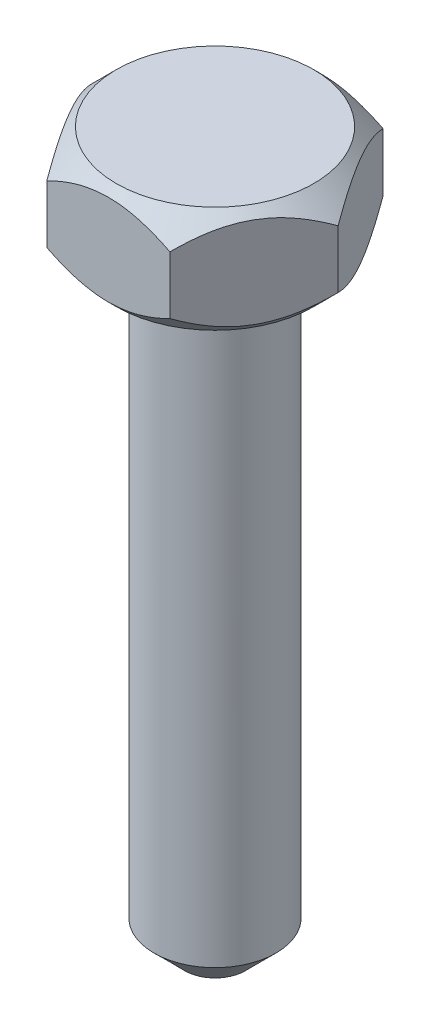
ISO-10303-21;
HEADER;
FILE_DESCRIPTION(('STEP AP214'),'2;1');
FILE_NAME('part.step','',(''),(''),'','','');
FILE_SCHEMA(('AUTOMOTIVE_DESIGN { 1 0 10303 214 1 1 1 1 }'));
ENDSEC;
DATA;
#1=APPLICATION_CONTEXT('core data for automotive mechanical design processes');
#2=APPLICATION_PROTOCOL_DEFINITION('international standard','automotive_design',2000,#1);
#3=PRODUCT_CONTEXT('',#1,'mechanical');
#4=PRODUCT('Part','Part','',(#3));
#5=PRODUCT_RELATED_PRODUCT_CATEGORY('part','',(#4));
#6=PRODUCT_DEFINITION_FORMATION('','',#4);
#7=PRODUCT_DEFINITION_CONTEXT('part definition',#1,'design');
#8=PRODUCT_DEFINITION('design','',#6,#7);
#9=PRODUCT_DEFINITION_SHAPE('','',#8);
#10=(LENGTH_UNIT() NAMED_UNIT(*) SI_UNIT(.MILLI.,.METRE.));
#11=(NAMED_UNIT(*) PLANE_ANGLE_UNIT() SI_UNIT($,.RADIAN.));
#12=(NAMED_UNIT(*) SI_UNIT($,.STERADIAN.) SOLID_ANGLE_UNIT());
#13=UNCERTAINTY_MEASURE_WITH_UNIT(LENGTH_MEASURE(1.E-05),#10,'distance_accuracy_value','');
#14=(GEOMETRIC_REPRESENTATION_CONTEXT(3) GLOBAL_UNCERTAINTY_ASSIGNED_CONTEXT((#13)) GLOBAL_UNIT_ASSIGNED_CONTEXT((#10,
#11,#12)) REPRESENTATION_CONTEXT('',''));
#15=CARTESIAN_POINT('',(0.,0.,0.));
#16=DIRECTION('',(0.,0.,1.));
#17=DIRECTION('',(1.,0.,0.));
#18=AXIS2_PLACEMENT_3D('',#15,#16,#17);
#19=CARTESIAN_POINT('',(-4.04145188432739,-3.5,0.));
#20=DIRECTION('',(0.,1.,0.));
#21=DIRECTION('',(0.,0.,1.));
#22=AXIS2_PLACEMENT_3D('',#19,#20,#21);
#23=PLANE('',#22);
#24=CARTESIAN_POINT('',(0.,-3.5,0.));
#25=DIRECTION('',(0.,1.,0.));
#26=DIRECTION('',(0.,0.,1.));
#27=AXIS2_PLACEMENT_3D('',#24,#25,#26);
#28=CIRCLE('',#27,3.24145188432739);
#29=CARTESIAN_POINT('',(0.,-3.5,3.24145188432739));
#30=VERTEX_POINT('',#29);
#31=EDGE_CURVE('E102',#30,#30,#28,.T.);
#32=ORIENTED_EDGE('',*,*,#31,.F.);
#33=EDGE_LOOP('',(#32));
#34=FACE_BOUND('',#33,.T.);
#35=CARTESIAN_POINT('',(0.,-3.5,0.));
#36=DIRECTION('',(0.,1.,0.));
#37=DIRECTION('',(0.,0.,1.));
#38=AXIS2_PLACEMENT_3D('',#35,#36,#37);
#39=CIRCLE('',#38,2.);
#40=CARTESIAN_POINT('',(0.,-3.5,2.));
#41=VERTEX_POINT('',#40);
#42=EDGE_CURVE('E117',#41,#41,#39,.F.);
#43=ORIENTED_EDGE('',*,*,#42,.F.);
#44=EDGE_LOOP('',(#43));
#45=FACE_BOUND('',#44,.T.);
#46=ADVANCED_FACE('F29',(#34,#45),#23,.F.);
#47=CARTESIAN_POINT('',(0.,-23.5,0.));
#48=DIRECTION('',(0.,1.,0.));
#49=DIRECTION('',(0.,0.,1.));
#50=AXIS2_PLACEMENT_3D('',#47,#48,#49);
#51=CYLINDRICAL_SURFACE('',#50,2.);
#52=CARTESIAN_POINT('',(0.,-22.5,0.));
#53=DIRECTION('',(0.,-1.,0.));
#54=DIRECTION('',(0.,0.,-1.));
#55=AXIS2_PLACEMENT_3D('',#52,#53,#54);
#56=CIRCLE('',#55,2.);
#57=CARTESIAN_POINT('',(0.,-22.5,-2.));
#58=VERTEX_POINT('',#57);
#59=EDGE_CURVE('E42',#58,#58,#56,.F.);
#60=ORIENTED_EDGE('',*,*,#59,.T.);
#61=EDGE_LOOP('',(#60));
#62=FACE_BOUND('',#61,.T.);
#63=ORIENTED_EDGE('',*,*,#42,.T.);
#64=EDGE_LOOP('',(#63));
#65=FACE_BOUND('',#64,.T.);
#66=ADVANCED_FACE('F126',(#62,#65),#51,.T.);
#67=CARTESIAN_POINT('',(0.,-23.5,0.));
#68=DIRECTION('',(0.,-1.,0.));
#69=DIRECTION('',(0.,0.,-1.));
#70=AXIS2_PLACEMENT_3D('',#67,#68,#69);
#71=PLANE('',#70);
#72=CARTESIAN_POINT('',(0.,-23.5,0.));
#73=DIRECTION('',(0.,-1.,0.));
#74=DIRECTION('',(0.,0.,-1.));
#75=AXIS2_PLACEMENT_3D('',#72,#73,#74);
#76=CIRCLE('',#75,0.999999999999997);
#77=CARTESIAN_POINT('',(0.,-23.5,-0.999999999999997));
#78=VERTEX_POINT('',#77);
#79=EDGE_CURVE('E120',#78,#78,#76,.T.);
#80=ORIENTED_EDGE('',*,*,#79,.T.);
#81=EDGE_LOOP('',(#80));
#82=FACE_BOUND('',#81,.T.);
#83=ADVANCED_FACE('F132',(#82),#71,.T.);
#84=CARTESIAN_POINT('',(0.,-23.5,0.));
#85=DIRECTION('',(0.,1.,0.));
#86=DIRECTION('',(0.,0.,1.));
#87=AXIS2_PLACEMENT_3D('',#84,#85,#86);
#88=CONICAL_SURFACE('',#87,0.999999999999997,0.785398163397447);
#89=ORIENTED_EDGE('',*,*,#59,.F.);
#90=EDGE_LOOP('',(#89));
#91=FACE_BOUND('',#90,.T.);
#92=ORIENTED_EDGE('',*,*,#79,.F.);
#93=EDGE_LOOP('',(#92));
#94=FACE_BOUND('',#93,.T.);
#95=ADVANCED_FACE('F129',(#91,#94),#88,.T.);
#96=CARTESIAN_POINT('',(0.,-3.5,0.));
#97=DIRECTION('',(0.,1.,0.));
#98=DIRECTION('',(0.,0.,1.));
#99=AXIS2_PLACEMENT_3D('',#96,#97,#98);
#100=CONICAL_SURFACE('',#99,3.24145188432739,0.785398163397448);
#101=CARTESIAN_POINT('',(-4.04156735438123,-2.69988452499759,0.000200000000024374));
#102=CARTESIAN_POINT('',(-3.97210706066971,-2.76928406626867,-0.120108757816985));
#103=CARTESIAN_POINT('',(-3.90148531215406,-2.83460752114448,-0.242429214365436));
#104=CARTESIAN_POINT('',(-3.75747991147154,-2.95421294831347,-0.491853884911885));
#105=CARTESIAN_POINT('',(-3.68408256574986,-3.00842837712061,-0.618981816842531));
#106=CARTESIAN_POINT('',(-3.53608035685404,-3.10130032476617,-0.875329162282505));
#107=CARTESIAN_POINT('',(-3.4615131811703,-3.14019025979249,-1.00448329914366));
#108=CARTESIAN_POINT('',(-3.310737295381,-3.20010809560693,-1.26563479388693));
#109=CARTESIAN_POINT('',(-3.2345331906662,-3.22118071965238,-1.39762417499826));
#110=CARTESIAN_POINT('',(-3.10319782183118,-3.24019388535166,-1.62510370665133));
#111=CARTESIAN_POINT('',(-3.04823615399914,-3.24300830014006,-1.72030010780514));
#112=CARTESIAN_POINT('',(-2.93840222621348,-3.23826531256006,-1.91053805112477));
#113=CARTESIAN_POINT('',(-2.88353000435282,-3.23070427424299,-2.00557952731161));
#114=CARTESIAN_POINT('',(-2.77430542200353,-3.20564210374561,-2.19476205337608));
#115=CARTESIAN_POINT('',(-2.71995371223669,-3.1881298536199,-2.28890197617048));
#116=CARTESIAN_POINT('',(-2.61218376551828,-3.14412110260569,-2.47556499941575));
#117=CARTESIAN_POINT('',(-2.55876545732786,-3.11762529053566,-2.56808822325595));
#118=CARTESIAN_POINT('',(-2.46393368006796,-3.06311203056568,-2.73234167964214));
#119=CARTESIAN_POINT('',(-2.42231028209656,-3.03652769615024,-2.80443551971227));
#120=CARTESIAN_POINT('',(-2.33981072759412,-2.97907462503668,-2.94732893971228));
#121=CARTESIAN_POINT('',(-2.29893459386685,-2.94820575783654,-3.01812848014491));
#122=CARTESIAN_POINT('',(-2.21805834837752,-2.88287565935588,-3.15821024645784));
#123=CARTESIAN_POINT('',(-2.17805593632086,-2.84842572434904,-3.22749645656527));
#124=CARTESIAN_POINT('',(-2.09879193666162,-2.77638590028467,-3.36478573118621));
#125=CARTESIAN_POINT('',(-2.05952991236256,-2.73879793793946,-3.43278955208019));
#126=CARTESIAN_POINT('',(-2.02061047210986,-2.69988452499759,-3.5002));
#127=B_SPLINE_CURVE_WITH_KNOTS('',3,(#101,#102,#103,#104,#105,#106,#107,#108,#109,#110,#111,
#112,#113,#114,#115,#116,#117,#118,#119,#120,#121,#122,#123,#124,#125,#126),.UNSPECIFIED.,.F.,
.F.,(4,2,2,2,2,2,2,2,2,2,2,2,4),(0.,0.466195029511836,0.93510605524767,1.39657035229711,
1.85687285909026,2.18628459516077,2.51581179896772,2.845707891424,3.17557869467338,
3.4376213889119,3.69967206642682,3.96091985737579,4.22200840855898),.UNSPECIFIED.);
#128=CARTESIAN_POINT('',(-4.04145188432739,-2.7,0.));
#129=VERTEX_POINT('',#128);
#130=CARTESIAN_POINT('',(-2.02072594216371,-2.7,-3.5));
#131=VERTEX_POINT('',#130);
#132=EDGE_CURVE('E177',#129,#131,#127,.T.);
#133=ORIENTED_EDGE('',*,*,#132,.T.);
#134=CARTESIAN_POINT('',(-4.11343909523356,-1.34049074854832,-3.5));
#135=CARTESIAN_POINT('',(-4.01364790461446,-1.41647576800568,-3.5));
#136=CARTESIAN_POINT('',(-3.91330741187747,-1.4917509457735,-3.5));
#137=CARTESIAN_POINT('',(-3.71130759190236,-1.64056086288985,-3.5));
#138=CARTESIAN_POINT('',(-3.60964794828074,-1.71409517230361,-3.5));
#139=CARTESIAN_POINT('',(-3.40404593483019,-1.85962589901091,-3.5));
#140=CARTESIAN_POINT('',(-3.30009198936034,-1.93160601709034,-3.5));
#141=CARTESIAN_POINT('',(-3.09043455319368,-2.07296300910746,-3.5));
#142=CARTESIAN_POINT('',(-2.98473118535169,-2.14234006473914,-3.5));
#143=CARTESIAN_POINT('',(-2.76489352426084,-2.28196781927053,-3.5));
#144=CARTESIAN_POINT('',(-2.65063360057755,-2.35202171786016,-3.5));
#145=CARTESIAN_POINT('',(-2.41943843809483,-2.48764015461377,-3.5));
#146=CARTESIAN_POINT('',(-2.30250276768208,-2.55320396159193,-3.5));
#147=CARTESIAN_POINT('',(-2.06594770908092,-2.6784356928961,-3.5));
#148=CARTESIAN_POINT('',(-1.94633756764447,-2.73812094705998,-3.5));
#149=CARTESIAN_POINT('',(-1.70380065325271,-2.85025883184051,-3.5));
#150=CARTESIAN_POINT('',(-1.58087544221088,-2.90271479977525,-3.5));
#151=CARTESIAN_POINT('',(-1.34256664054354,-2.99425414604565,-3.5));
#152=CARTESIAN_POINT('',(-1.22748347184254,-3.03411159832747,-3.5));
#153=CARTESIAN_POINT('',(-0.994473602956439,-3.10460445258339,-3.5));
#154=CARTESIAN_POINT('',(-0.876546714407832,-3.13523924184055,-3.5));
#155=CARTESIAN_POINT('',(-0.640555797612561,-3.18515136149643,-3.5));
#156=CARTESIAN_POINT('',(-0.522534731770002,-3.20462846737207,-3.5));
#157=CARTESIAN_POINT('',(-0.285138833258746,-3.23183388871137,-3.5));
#158=CARTESIAN_POINT('',(-0.165764258218942,-3.23956440343576,-3.5));
#159=CARTESIAN_POINT('',(0.0684345425591306,-3.24266430583436,-3.5));
#160=CARTESIAN_POINT('',(0.183252604656246,-3.23850904804464,-3.5));
#161=CARTESIAN_POINT('',(0.41194538139855,-3.21913596089254,-3.5));
#162=CARTESIAN_POINT('',(0.525820005903612,-3.20391708651605,-3.5));
#163=CARTESIAN_POINT('',(0.753728692005361,-3.16300182207144,-3.5));
#164=CARTESIAN_POINT('',(0.867729673651151,-3.13712416826838,-3.5));
#165=CARTESIAN_POINT('',(1.09323660944141,-3.07629621041035,-3.5));
#166=CARTESIAN_POINT('',(1.20474274230377,-3.04134655850057,-3.5));
#167=CARTESIAN_POINT('',(1.43351745819777,-2.96089193875029,-3.5));
#168=CARTESIAN_POINT('',(1.55057121674902,-2.91478260530312,-3.5));
#169=CARTESIAN_POINT('',(1.78163768388521,-2.81546896217881,-3.5));
#170=CARTESIAN_POINT('',(1.8956493792125,-2.76226232305919,-3.5));
#171=CARTESIAN_POINT('',(2.12120309504484,-2.65000927106598,-3.5));
#172=CARTESIAN_POINT('',(2.23273581617762,-2.59094432351664,-3.5));
#173=CARTESIAN_POINT('',(2.45323999840432,-2.46828035973536,-3.5));
#174=CARTESIAN_POINT('',(2.56221185705048,-2.40468205353482,-3.5));
#175=CARTESIAN_POINT('',(2.77258648527557,-2.27708230144591,-3.5));
#176=CARTESIAN_POINT('',(2.87409670716152,-2.21325707762329,-3.5));
#177=CARTESIAN_POINT('',(3.07537374659972,-2.08290631812229,-3.5));
#178=CARTESIAN_POINT('',(3.17514043189724,-2.01638057885912,-3.5));
#179=CARTESIAN_POINT('',(3.37235277259435,-1.88165662424084,-3.5));
#180=CARTESIAN_POINT('',(3.46981066719971,-1.81347626064957,-3.5));
#181=CARTESIAN_POINT('',(3.66339199507936,-1.67530022312019,-3.5));
#182=CARTESIAN_POINT('',(3.75951578844138,-1.60530505424452,-3.5));
#183=CARTESIAN_POINT('',(3.85508044256854,-1.53456747820942,-3.5));
#184=B_SPLINE_CURVE_WITH_KNOTS('',3,(#134,#135,#136,#137,#138,#139,#140,#141,#142,#143,#144,
#145,#146,#147,#148,#149,#150,#151,#152,#153,#154,#155,#156,#157,#158,#159,#160,#161,#162,#163,
#164,#165,#166,#167,#168,#169,#170,#171,#172,#173,#174,#175,#176,#177,#178,#179,#180,#181,#182,
#183),.UNSPECIFIED.,.F.,.F.,(4,2,2,2,2,2,2,2,2,2,2,2,2,2,2,2,2,2,2,2,2,2,2,2,4),(0.,
0.376289066832934,0.752670114666427,1.13196303882771,1.51122943887124,1.91322439656266,
2.31528466194431,2.71612176675466,3.11677320534959,3.48182442073459,3.84689988331699,
4.20521619183289,4.56346540614943,4.90758964289977,5.25174638813573,5.60201478075691,
5.95225800112648,6.32939036689254,6.70664681914763,7.08513741857289,7.46356886710629,
7.82324340751906,8.18294511339456,8.53974109313966,8.89643881996947),.UNSPECIFIED.);
#185=CARTESIAN_POINT('',(2.02072594216368,-2.7,-3.50000000000001));
#186=VERTEX_POINT('',#185);
#187=EDGE_CURVE('E171',#131,#186,#184,.T.);
#188=ORIENTED_EDGE('',*,*,#187,.T.);
#189=CARTESIAN_POINT('',(2.02061047210985,-2.69988452499759,-3.5002));
#190=CARTESIAN_POINT('',(2.09007076582137,-2.76928406626868,-3.37989124218299));
#191=CARTESIAN_POINT('',(2.16069251433702,-2.83460752114448,-3.25757078563454));
#192=CARTESIAN_POINT('',(2.30469791501954,-2.95421294831348,-3.00814611508809));
#193=CARTESIAN_POINT('',(2.37809526074122,-3.00842837712062,-2.88101818315745));
#194=CARTESIAN_POINT('',(2.52609746963704,-3.10130032476618,-2.62467083771748));
#195=CARTESIAN_POINT('',(2.60066464532078,-3.14019025979249,-2.49551670085632));
#196=CARTESIAN_POINT('',(2.75144053111008,-3.20010809560693,-2.23436520611305));
#197=CARTESIAN_POINT('',(2.82764463582487,-3.22118071965239,-2.10237582500172));
#198=CARTESIAN_POINT('',(2.9589800046599,-3.24019388535166,-1.87489629334866));
#199=CARTESIAN_POINT('',(3.01394167249194,-3.24300830014006,-1.77969989219485));
#200=CARTESIAN_POINT('',(3.1237756002776,-3.23826531256006,-1.58946194887522));
#201=CARTESIAN_POINT('',(3.17864782213825,-3.230704274243,-1.49442047268838));
#202=CARTESIAN_POINT('',(3.28787240448755,-3.20564210374561,-1.30523794662391));
#203=CARTESIAN_POINT('',(3.34222411425439,-3.1881298536199,-1.21109802382951));
#204=CARTESIAN_POINT('',(3.4499940609728,-3.14412110260569,-1.02443500058424));
#205=CARTESIAN_POINT('',(3.50341236916322,-3.11762529053566,-0.931911776744044));
#206=CARTESIAN_POINT('',(3.59824414642312,-3.06311203056568,-0.767658320357851));
#207=CARTESIAN_POINT('',(3.63986754439452,-3.03652769615024,-0.695564480287724));
#208=CARTESIAN_POINT('',(3.72236709889696,-2.97907462503668,-0.552671060287705));
#209=CARTESIAN_POINT('',(3.76324323262423,-2.94820575783654,-0.48187151985508));
#210=CARTESIAN_POINT('',(3.84411947811356,-2.88287565935588,-0.34178975354215));
#211=CARTESIAN_POINT('',(3.88412189017022,-2.84842572434904,-0.272503543434717));
#212=CARTESIAN_POINT('',(3.96338588982947,-2.77638590028467,-0.135214268813778));
#213=CARTESIAN_POINT('',(4.00264791412853,-2.73879793793945,-0.0672104479197994));
#214=CARTESIAN_POINT('',(4.04156735438122,-2.69988452499759,0.000200000000013168));
#215=B_SPLINE_CURVE_WITH_KNOTS('',3,(#189,#190,#191,#192,#193,#194,#195,#196,#197,#198,#199,
#200,#201,#202,#203,#204,#205,#206,#207,#208,#209,#210,#211,#212,#213,#214),.UNSPECIFIED.,.F.,
.F.,(4,2,2,2,2,2,2,2,2,2,2,2,4),(0.,0.466195029511833,0.935106055247664,1.3965703522971,
1.85687285909024,2.18628459516076,2.51581179896771,2.84570789142399,3.17557869467336,
3.43762138891188,3.69967206642681,3.96091985737578,4.22200840855897),.UNSPECIFIED.);
#216=CARTESIAN_POINT('',(4.04145188432739,-2.7,0.));
#217=VERTEX_POINT('',#216);
#218=EDGE_CURVE('E90',#186,#217,#215,.T.);
#219=ORIENTED_EDGE('',*,*,#218,.T.);
#220=CARTESIAN_POINT('',(4.04156735438122,-2.69988452499759,-0.000199999999987047));
#221=CARTESIAN_POINT('',(3.9721070606697,-2.76928406626868,0.120108757817022));
#222=CARTESIAN_POINT('',(3.90148531215406,-2.83460752114448,0.242429214365472));
#223=CARTESIAN_POINT('',(3.75747991147153,-2.95421294831348,0.491853884911919));
#224=CARTESIAN_POINT('',(3.68408256574985,-3.00842837712061,0.618981816842565));
#225=CARTESIAN_POINT('',(3.53608035685403,-3.10130032476617,0.875329162282538));
#226=CARTESIAN_POINT('',(3.46151318117029,-3.14019025979249,1.00448329914369));
#227=CARTESIAN_POINT('',(3.31073729538099,-3.20010809560693,1.26563479388696));
#228=CARTESIAN_POINT('',(3.23453319066619,-3.22118071965239,1.39762417499829));
#229=CARTESIAN_POINT('',(3.10319782183116,-3.24019388535166,1.62510370665136));
#230=CARTESIAN_POINT('',(3.04823615399913,-3.24300830014006,1.72030010780516));
#231=CARTESIAN_POINT('',(2.93840222621346,-3.23826531256006,1.91053805112479));
#232=CARTESIAN_POINT('',(2.88353000435281,-3.230704274243,2.00557952731163));
#233=CARTESIAN_POINT('',(2.77430542200351,-3.20564210374561,2.19476205337611));
#234=CARTESIAN_POINT('',(2.71995371223667,-3.1881298536199,2.2889019761705));
#235=CARTESIAN_POINT('',(2.61218376551826,-3.14412110260569,2.47556499941577));
#236=CARTESIAN_POINT('',(2.55876545732783,-3.11762529053566,2.56808822325597));
#237=CARTESIAN_POINT('',(2.46393368006794,-3.06311203056568,2.73234167964216));
#238=CARTESIAN_POINT('',(2.42231028209654,-3.03652769615024,2.80443551971228));
#239=CARTESIAN_POINT('',(2.3398107275941,-2.97907462503668,2.9473289397123));
#240=CARTESIAN_POINT('',(2.29893459386683,-2.94820575783654,3.01812848014492));
#241=CARTESIAN_POINT('',(2.2180583483775,-2.88287565935588,3.15821024645785));
#242=CARTESIAN_POINT('',(2.17805593632084,-2.84842572434904,3.22749645656528));
#243=CARTESIAN_POINT('',(2.0987919366616,-2.77638590028468,3.36478573118621));
#244=CARTESIAN_POINT('',(2.05952991236254,-2.73879793793947,3.43278955208019));
#245=CARTESIAN_POINT('',(2.02061047210984,-2.6998845249976,3.5002));
#246=B_SPLINE_CURVE_WITH_KNOTS('',3,(#220,#221,#222,#223,#224,#225,#226,#227,#228,#229,#230,
#231,#232,#233,#234,#235,#236,#237,#238,#239,#240,#241,#242,#243,#244,#245),.UNSPECIFIED.,.F.,
.F.,(4,2,2,2,2,2,2,2,2,2,2,2,4),(0.,0.466195029511836,0.93510605524767,1.39657035229711,
1.85687285909025,2.18628459516077,2.51581179896772,2.845707891424,3.17557869467337,
3.43762138891189,3.69967206642681,3.96091985737577,4.22200840855895),.UNSPECIFIED.);
#247=CARTESIAN_POINT('',(2.02072594216371,-2.7,3.5));
#248=VERTEX_POINT('',#247);
#249=EDGE_CURVE('E86',#217,#248,#246,.T.);
#250=ORIENTED_EDGE('',*,*,#249,.T.);
#251=CARTESIAN_POINT('',(-4.11343909532792,-1.34049074847645,3.5));
#252=CARTESIAN_POINT('',(-4.01364790470614,-1.41647576793658,3.5));
#253=CARTESIAN_POINT('',(-3.91330741196645,-1.49175094570717,3.5));
#254=CARTESIAN_POINT('',(-3.71130759198594,-1.64056086282906,3.5));
#255=CARTESIAN_POINT('',(-3.6096479483616,-1.71409517224557,3.5));
#256=CARTESIAN_POINT('',(-3.40404593490552,-1.8596258989584,3.5));
#257=CARTESIAN_POINT('',(-3.30009198943286,-1.9316060170406,3.5));
#258=CARTESIAN_POINT('',(-3.09043455326054,-2.07296300906322,3.5));
#259=CARTESIAN_POINT('',(-2.98473118541569,-2.14234006469764,3.5));
#260=CARTESIAN_POINT('',(-2.76489352431867,-2.28196781923471,3.5));
#261=CARTESIAN_POINT('',(-2.65063360063206,-2.35202171782728,3.5));
#262=CARTESIAN_POINT('',(-2.41943843814258,-2.48764015458666,3.5));
#263=CARTESIAN_POINT('',(-2.3025027677264,-2.55320396156762,3.5));
#264=CARTESIAN_POINT('',(-2.06594770911824,-2.67843569287718,3.5));
#265=CARTESIAN_POINT('',(-1.94633756767823,-2.73812094704364,3.5));
#266=CARTESIAN_POINT('',(-1.70380065327916,-2.85025883182901,3.5));
#267=CARTESIAN_POINT('',(-1.58087544223358,-2.902714799766,3.5));
#268=CARTESIAN_POINT('',(-1.34256664056464,-2.99425414603802,3.5));
#269=CARTESIAN_POINT('',(-1.22748347186597,-3.03411159831963,3.5));
#270=CARTESIAN_POINT('',(-0.994473602984598,-3.10460445257561,3.5));
#271=CARTESIAN_POINT('',(-0.876546714438396,-3.13523924183304,3.5));
#272=CARTESIAN_POINT('',(-0.640555797647857,-3.18515136148999,3.5));
#273=CARTESIAN_POINT('',(-0.522534731807625,-3.20462846736643,3.5));
#274=CARTESIAN_POINT('',(-0.285138833300951,-3.23183388870786,3.5));
#275=CARTESIAN_POINT('',(-0.165764258263403,-3.23956440343358,3.5));
#276=CARTESIAN_POINT('',(0.0684345425106541,-3.24266430583524,3.5));
#277=CARTESIAN_POINT('',(0.183252604606004,-3.23850904804722,3.5));
#278=CARTESIAN_POINT('',(0.411945381344963,-3.21913596089876,3.5));
#279=CARTESIAN_POINT('',(0.525820005848445,-3.20391708652421,3.5));
#280=CARTESIAN_POINT('',(0.753728691947076,-3.16300182208367,3.5));
#281=CARTESIAN_POINT('',(0.867729673591332,-3.13712416828275,3.5));
#282=CARTESIAN_POINT('',(1.09323660937868,-3.07629621042903,3.5));
#283=CARTESIAN_POINT('',(1.20474274223966,-3.04134655852143,3.5));
#284=CARTESIAN_POINT('',(1.4335174581261,-2.96089193877731,3.5));
#285=CARTESIAN_POINT('',(1.5505712166713,-2.9147826053345,3.5));
#286=CARTESIAN_POINT('',(1.78163768379569,-2.81546896221932,3.5));
#287=CARTESIAN_POINT('',(1.89564937911723,-2.76226232310448,3.5));
#288=CARTESIAN_POINT('',(2.12120309493829,-2.65000927112113,3.5));
#289=CARTESIAN_POINT('',(2.23273581606554,-2.59094432357686,3.5));
#290=CARTESIAN_POINT('',(2.45323999828135,-2.46828035980589,3.5));
#291=CARTESIAN_POINT('',(2.56221185692215,-2.40468205361059,3.5));
#292=CARTESIAN_POINT('',(2.77258648513752,-2.27708230153161,3.5));
#293=CARTESIAN_POINT('',(2.87409670701908,-2.21325707771367,3.5));
#294=CARTESIAN_POINT('',(3.07537374644856,-2.08290631822205,3.5));
#295=CARTESIAN_POINT('',(3.17514043174175,-2.01638057896358,3.5));
#296=CARTESIAN_POINT('',(3.37235277243031,-1.88165662435465,3.5));
#297=CARTESIAN_POINT('',(3.46981066703145,-1.81347626076803,3.5));
#298=CARTESIAN_POINT('',(3.66339199490269,-1.67530022324793,3.5));
#299=CARTESIAN_POINT('',(3.75951578826051,-1.60530505437691,3.5));
#300=CARTESIAN_POINT('',(3.85508044238348,-1.53456747834644,3.5));
#301=B_SPLINE_CURVE_WITH_KNOTS('',3,(#251,#252,#253,#254,#255,#256,#257,#258,#259,#260,#261,
#262,#263,#264,#265,#266,#267,#268,#269,#270,#271,#272,#273,#274,#275,#276,#277,#278,#279,#280,
#281,#282,#283,#284,#285,#286,#287,#288,#289,#290,#291,#292,#293,#294,#295,#296,#297,#298,#299,
#300),.UNSPECIFIED.,.F.,.F.,(4,2,2,2,2,2,2,2,2,2,2,2,2,2,2,2,2,2,2,2,2,2,2,2,4),(0.,
0.376289066844382,0.752670114689327,1.13196303886228,1.51122943891747,1.91322439662199,
2.31528466201676,2.7161217668401,3.11677320544801,3.48182442082625,3.84689988340191,
4.20521619191135,4.56346540622143,4.90758964296631,5.25174638819682,5.60201478081209,
5.95225800117576,6.32939036692017,6.70664681915359,7.08513741855706,7.46356886706867,
7.82324340746283,8.1829451133197,8.53974109304643,8.89643881985787),.UNSPECIFIED.);
#302=CARTESIAN_POINT('',(-2.02072594216367,-2.70000000000002,3.5));
#303=VERTEX_POINT('',#302);
#304=EDGE_CURVE('E48',#248,#303,#301,.F.);
#305=ORIENTED_EDGE('',*,*,#304,.T.);
#306=CARTESIAN_POINT('',(-2.02061047210983,-2.69988452499761,3.5002));
#307=CARTESIAN_POINT('',(-2.09007076582135,-2.76928406626869,3.37989124218299));
#308=CARTESIAN_POINT('',(-2.160692514337,-2.83460752114449,3.25757078563455));
#309=CARTESIAN_POINT('',(-2.30469791501952,-2.95421294831349,3.0081461150881));
#310=CARTESIAN_POINT('',(-2.3780952607412,-3.00842837712062,2.88101818315746));
#311=CARTESIAN_POINT('',(-2.52609746963702,-3.10130032476618,2.62467083771749));
#312=CARTESIAN_POINT('',(-2.60066464532076,-3.14019025979249,2.49551670085634));
#313=CARTESIAN_POINT('',(-2.75144053111006,-3.20010809560693,2.23436520611307));
#314=CARTESIAN_POINT('',(-2.82764463582486,-3.22118071965239,2.10237582500175));
#315=CARTESIAN_POINT('',(-2.95898000465988,-3.24019388535166,1.87489629334868));
#316=CARTESIAN_POINT('',(-3.01394167249192,-3.24300830014006,1.77969989219488));
#317=CARTESIAN_POINT('',(-3.12377560027759,-3.23826531256006,1.58946194887525));
#318=CARTESIAN_POINT('',(-3.17864782213824,-3.23070427424299,1.49442047268841));
#319=CARTESIAN_POINT('',(-3.28787240448754,-3.20564210374561,1.30523794662394));
#320=CARTESIAN_POINT('',(-3.34222411425438,-3.1881298536199,1.21109802382954));
#321=CARTESIAN_POINT('',(-3.44999406097279,-3.14412110260569,1.02443500058427));
#322=CARTESIAN_POINT('',(-3.50341236916322,-3.11762529053566,0.931911776744076));
#323=CARTESIAN_POINT('',(-3.59824414642311,-3.06311203056568,0.767658320357883));
#324=CARTESIAN_POINT('',(-3.63986754439451,-3.03652769615024,0.695564480287757));
#325=CARTESIAN_POINT('',(-3.72236709889695,-2.97907462503668,0.552671060287739));
#326=CARTESIAN_POINT('',(-3.76324323262423,-2.94820575783654,0.481871519855115));
#327=CARTESIAN_POINT('',(-3.84411947811356,-2.88287565935587,0.341789753542185));
#328=CARTESIAN_POINT('',(-3.88412189017022,-2.84842572434903,0.272503543434753));
#329=CARTESIAN_POINT('',(-3.96338588982947,-2.77638590028466,0.135214268813814));
#330=CARTESIAN_POINT('',(-4.00264791412853,-2.73879793793945,0.0672104479198363));
#331=CARTESIAN_POINT('',(-4.04156735438123,-2.69988452499759,-0.000199999999975872));
#332=B_SPLINE_CURVE_WITH_KNOTS('',3,(#306,#307,#308,#309,#310,#311,#312,#313,#314,#315,#316,
#317,#318,#319,#320,#321,#322,#323,#324,#325,#326,#327,#328,#329,#330,#331),.UNSPECIFIED.,.F.,
.F.,(4,2,2,2,2,2,2,2,2,2,2,2,4),(0.,0.466195029511828,0.935106055247654,1.39657035229708,
1.85687285909022,2.18628459516074,2.51581179896768,2.84570789142397,3.17557869467334,
3.43762138891186,3.69967206642679,3.96091985737576,4.22200840855895),.UNSPECIFIED.);
#333=EDGE_CURVE('E11',#303,#129,#332,.T.);
#334=ORIENTED_EDGE('',*,*,#333,.T.);
#335=EDGE_LOOP('',(#133,#188,#219,#250,#305,#334));
#336=FACE_BOUND('',#335,.T.);
#337=ORIENTED_EDGE('',*,*,#31,.T.);
#338=EDGE_LOOP('',(#337));
#339=FACE_BOUND('',#338,.T.);
#340=ADVANCED_FACE('F87',(#336,#339),#100,.T.);
#341=CARTESIAN_POINT('',(-4.04145188432739,0.,0.));
#342=DIRECTION('',(0.,1.,0.));
#343=DIRECTION('',(0.,0.,1.));
#344=AXIS2_PLACEMENT_3D('',#341,#342,#343);
#345=PLANE('',#344);
#346=CARTESIAN_POINT('',(0.,0.,0.));
#347=DIRECTION('',(0.,1.,0.));
#348=DIRECTION('',(0.,0.,1.));
#349=AXIS2_PLACEMENT_3D('',#346,#347,#348);
#350=CIRCLE('',#349,3.24145188432739);
#351=CARTESIAN_POINT('',(0.,0.,3.24145188432739));
#352=VERTEX_POINT('',#351);
#353=EDGE_CURVE('E234',#352,#352,#350,.T.);
#354=ORIENTED_EDGE('',*,*,#353,.T.);
#355=EDGE_LOOP('',(#354));
#356=FACE_BOUND('',#355,.T.);
#357=ADVANCED_FACE('F152',(#356),#345,.T.);
#358=CARTESIAN_POINT('',(0.,-0.8,0.));
#359=DIRECTION('',(0.,-1.,0.));
#360=DIRECTION('',(0.,0.,-1.));
#361=AXIS2_PLACEMENT_3D('',#358,#359,#360);
#362=CONICAL_SURFACE('',#361,4.04145188432739,0.785398163397448);
#363=CARTESIAN_POINT('',(-2.02061047210986,-0.800115475002408,-3.5002));
#364=CARTESIAN_POINT('',(-2.09007076582138,-0.730715933731321,-3.37989124218299));
#365=CARTESIAN_POINT('',(-2.16069251433702,-0.665392478855521,-3.25757078563454));
#366=CARTESIAN_POINT('',(-2.30469791501955,-0.545787051686524,-3.00814611508809));
#367=CARTESIAN_POINT('',(-2.37809526074123,-0.491571622879386,-2.88101818315745));
#368=CARTESIAN_POINT('',(-2.52609746963704,-0.398699675233827,-2.62467083771747));
#369=CARTESIAN_POINT('',(-2.60066464532078,-0.359809740207512,-2.49551670085632));
#370=CARTESIAN_POINT('',(-2.75144053111008,-0.299891904393072,-2.23436520611305));
#371=CARTESIAN_POINT('',(-2.82764463582488,-0.278819280347616,-2.10237582500172));
#372=CARTESIAN_POINT('',(-2.95898000465991,-0.259806114648342,-1.87489629334865));
#373=CARTESIAN_POINT('',(-3.01394167249194,-0.256991699859938,-1.77969989219485));
#374=CARTESIAN_POINT('',(-3.12377560027761,-0.261734687439937,-1.58946194887522));
#375=CARTESIAN_POINT('',(-3.17864782213826,-0.269295725757006,-1.49442047268838));
#376=CARTESIAN_POINT('',(-3.28787240448756,-0.294357896254393,-1.3052379466239));
#377=CARTESIAN_POINT('',(-3.34222411425439,-0.311870146380099,-1.2110980238295));
#378=CARTESIAN_POINT('',(-3.4499940609728,-0.355878897394313,-1.02443500058423));
#379=CARTESIAN_POINT('',(-3.50341236916323,-0.382374709464336,-0.931911776744037));
#380=CARTESIAN_POINT('',(-3.59824414642312,-0.436887969434318,-0.767658320357844));
#381=CARTESIAN_POINT('',(-3.63986754439452,-0.463472303849764,-0.695564480287717));
#382=CARTESIAN_POINT('',(-3.72236709889696,-0.520925374963324,-0.552671060287697));
#383=CARTESIAN_POINT('',(-3.76324323262424,-0.551794242163462,-0.481871519855072));
#384=CARTESIAN_POINT('',(-3.84411947811357,-0.617124340644127,-0.34178975354214));
#385=CARTESIAN_POINT('',(-3.88412189017022,-0.651574275650966,-0.272503543434707));
#386=CARTESIAN_POINT('',(-3.96338588982947,-0.723614099715335,-0.135214268813767));
#387=CARTESIAN_POINT('',(-4.00264791412853,-0.761202062060548,-0.0672104479197882));
#388=CARTESIAN_POINT('',(-4.04156735438123,-0.800115475002413,0.000200000000024814));
#389=B_SPLINE_CURVE_WITH_KNOTS('',3,(#363,#364,#365,#366,#367,#368,#369,#370,#371,#372,#373,
#374,#375,#376,#377,#378,#379,#380,#381,#382,#383,#384,#385,#386,#387,#388),.UNSPECIFIED.,.F.,
.F.,(4,2,2,2,2,2,2,2,2,2,2,2,4),(0.,0.466195029511835,0.935106055247666,1.3965703522971,
1.85687285909025,2.18628459516076,2.51581179896771,2.84570789142399,3.17557869467337,
3.43762138891189,3.69967206642682,3.96091985737579,4.22200840855898),.UNSPECIFIED.);
#390=CARTESIAN_POINT('',(-2.02072594216371,-0.8,-3.5));
#391=VERTEX_POINT('',#390);
#392=CARTESIAN_POINT('',(-4.04145188432739,-0.8,0.));
#393=VERTEX_POINT('',#392);
#394=EDGE_CURVE('E116',#391,#393,#389,.T.);
#395=ORIENTED_EDGE('',*,*,#394,.T.);
#396=CARTESIAN_POINT('',(-4.04156735438123,-0.800115475002413,-0.000199999999975714));
#397=CARTESIAN_POINT('',(-3.97210706066971,-0.730715933731325,0.120108757817033));
#398=CARTESIAN_POINT('',(-3.90148531215406,-0.665392478855525,0.242429214365483));
#399=CARTESIAN_POINT('',(-3.75747991147153,-0.545787051686527,0.491853884911931));
#400=CARTESIAN_POINT('',(-3.68408256574985,-0.491571622879388,0.618981816842576));
#401=CARTESIAN_POINT('',(-3.53608035685403,-0.398699675233828,0.875329162282549));
#402=CARTESIAN_POINT('',(-3.46151318117029,-0.359809740207512,1.00448329914371));
#403=CARTESIAN_POINT('',(-3.31073729538099,-0.299891904393072,1.26563479388697));
#404=CARTESIAN_POINT('',(-3.23453319066619,-0.278819280347615,1.3976241749983));
#405=CARTESIAN_POINT('',(-3.10319782183116,-0.259806114648341,1.62510370665137));
#406=CARTESIAN_POINT('',(-3.04823615399912,-0.256991699859937,1.72030010780518));
#407=CARTESIAN_POINT('',(-2.93840222621345,-0.261734687439936,1.9105380511248));
#408=CARTESIAN_POINT('',(-2.8835300043528,-0.269295725757005,2.00557952731164));
#409=CARTESIAN_POINT('',(-2.7743054220035,-0.294357896254393,2.19476205337612));
#410=CARTESIAN_POINT('',(-2.71995371223666,-0.311870146380099,2.28890197617051));
#411=CARTESIAN_POINT('',(-2.61218376551825,-0.355878897394312,2.47556499941578));
#412=CARTESIAN_POINT('',(-2.55876545732782,-0.382374709464335,2.56808822325598));
#413=CARTESIAN_POINT('',(-2.46393368006793,-0.436887969434316,2.73234167964217));
#414=CARTESIAN_POINT('',(-2.42231028209653,-0.463472303849761,2.80443551971229));
#415=CARTESIAN_POINT('',(-2.33981072759409,-0.520925374963318,2.9473289397123));
#416=CARTESIAN_POINT('',(-2.29893459386682,-0.551794242163455,3.01812848014493));
#417=CARTESIAN_POINT('',(-2.21805834837749,-0.617124340644116,3.15821024645785));
#418=CARTESIAN_POINT('',(-2.17805593632083,-0.651574275650953,3.22749645656528));
#419=CARTESIAN_POINT('',(-2.09879193666159,-0.723614099715318,3.36478573118622));
#420=CARTESIAN_POINT('',(-2.05952991236253,-0.76120206206053,3.43278955208019));
#421=CARTESIAN_POINT('',(-2.02061047210983,-0.800115475002393,3.5002));
#422=B_SPLINE_CURVE_WITH_KNOTS('',3,(#396,#397,#398,#399,#400,#401,#402,#403,#404,#405,#406,
#407,#408,#409,#410,#411,#412,#413,#414,#415,#416,#417,#418,#419,#420,#421),.UNSPECIFIED.,.F.,
.F.,(4,2,2,2,2,2,2,2,2,2,2,2,4),(0.,0.466195029511837,0.935106055247671,1.39657035229711,
1.85687285909026,2.18628459516077,2.51581179896772,2.84570789142401,3.17557869467338,
3.43762138891189,3.69967206642681,3.96091985737576,4.22200840855895),.UNSPECIFIED.);
#423=CARTESIAN_POINT('',(-2.02072594216365,-0.8,3.50000000000003));
#424=VERTEX_POINT('',#423);
#425=EDGE_CURVE('E237',#393,#424,#422,.T.);
#426=ORIENTED_EDGE('',*,*,#425,.T.);
#427=CARTESIAN_POINT('',(-4.11343909532793,-2.15950925152355,3.5));
#428=CARTESIAN_POINT('',(-4.01364790470614,-2.08352423206342,3.5));
#429=CARTESIAN_POINT('',(-3.91330741196646,-2.00824905429283,3.5));
#430=CARTESIAN_POINT('',(-3.71130759198594,-1.85943913717094,3.5));
#431=CARTESIAN_POINT('',(-3.60964794836161,-1.78590482775443,3.5));
#432=CARTESIAN_POINT('',(-3.40404593490553,-1.6403741010416,3.5));
#433=CARTESIAN_POINT('',(-3.30009198943287,-1.5683939829594,3.5));
#434=CARTESIAN_POINT('',(-3.09043455326054,-1.42703699093678,3.5));
#435=CARTESIAN_POINT('',(-2.98473118541569,-1.35765993530236,3.5));
#436=CARTESIAN_POINT('',(-2.76489352431867,-1.21803218076529,3.5));
#437=CARTESIAN_POINT('',(-2.65063360063206,-1.14797828217272,3.5));
#438=CARTESIAN_POINT('',(-2.41943843814258,-1.01235984541334,3.5));
#439=CARTESIAN_POINT('',(-2.3025027677264,-0.946796038432376,3.5));
#440=CARTESIAN_POINT('',(-2.06594770911824,-0.82156430712282,3.5));
#441=CARTESIAN_POINT('',(-1.94633756767823,-0.761879052956364,3.5));
#442=CARTESIAN_POINT('',(-1.70380065327916,-0.649741168170993,3.5));
#443=CARTESIAN_POINT('',(-1.58087544223358,-0.597285200233999,3.5));
#444=CARTESIAN_POINT('',(-1.34256664056464,-0.505745853961981,3.5));
#445=CARTESIAN_POINT('',(-1.22748347186597,-0.465888401680367,3.5));
#446=CARTESIAN_POINT('',(-0.994473602984597,-0.395395547424385,3.5));
#447=CARTESIAN_POINT('',(-0.876546714438396,-0.364760758166964,3.5));
#448=CARTESIAN_POINT('',(-0.640555797647857,-0.314848638510007,3.5));
#449=CARTESIAN_POINT('',(-0.522534731807625,-0.295371532633568,3.5));
#450=CARTESIAN_POINT('',(-0.285138833300952,-0.268166111292142,3.5));
#451=CARTESIAN_POINT('',(-0.165764258263404,-0.260435596566415,3.5));
#452=CARTESIAN_POINT('',(0.0684345425106533,-0.257335694164756,3.5));
#453=CARTESIAN_POINT('',(0.183252604606004,-0.261490951952784,3.5));
#454=CARTESIAN_POINT('',(0.411945381344962,-0.280864039101239,3.5));
#455=CARTESIAN_POINT('',(0.525820005848444,-0.29608291347579,3.5));
#456=CARTESIAN_POINT('',(0.753728691947075,-0.336998177916329,3.5));
#457=CARTESIAN_POINT('',(0.867729673591331,-0.362875831717248,3.5));
#458=CARTESIAN_POINT('',(1.09323660937868,-0.423703789570965,3.5));
#459=CARTESIAN_POINT('',(1.20474274223966,-0.458653441478571,3.5));
#460=CARTESIAN_POINT('',(1.43351745812609,-0.539108061222685,3.5));
#461=CARTESIAN_POINT('',(1.5505712166713,-0.585217394665504,3.5));
#462=CARTESIAN_POINT('',(1.78163768379568,-0.684531037780684,3.5));
#463=CARTESIAN_POINT('',(1.89564937911723,-0.737737676895517,3.5));
#464=CARTESIAN_POINT('',(2.12120309493829,-0.849990728878866,3.5));
#465=CARTESIAN_POINT('',(2.23273581606554,-0.909055676423135,3.5));
#466=CARTESIAN_POINT('',(2.45323999828134,-1.03171964019411,3.5));
#467=CARTESIAN_POINT('',(2.56221185692215,-1.09531794638941,3.5));
#468=CARTESIAN_POINT('',(2.77258648513752,-1.22291769846839,3.5));
#469=CARTESIAN_POINT('',(2.87409670701908,-1.28674292228633,3.5));
#470=CARTESIAN_POINT('',(3.07537374644856,-1.41709368177794,3.5));
#471=CARTESIAN_POINT('',(3.17514043174175,-1.48361942103641,3.5));
#472=CARTESIAN_POINT('',(3.37235277243031,-1.61834337564535,3.5));
#473=CARTESIAN_POINT('',(3.46981066703144,-1.68652373923197,3.5));
#474=CARTESIAN_POINT('',(3.66339199490268,-1.82469977675207,3.5));
#475=CARTESIAN_POINT('',(3.75951578826051,-1.89469494562309,3.5));
#476=CARTESIAN_POINT('',(3.85508044238347,-1.96543252165356,3.5));
#477=B_SPLINE_CURVE_WITH_KNOTS('',3,(#427,#428,#429,#430,#431,#432,#433,#434,#435,#436,#437,
#438,#439,#440,#441,#442,#443,#444,#445,#446,#447,#448,#449,#450,#451,#452,#453,#454,#455,#456,
#457,#458,#459,#460,#461,#462,#463,#464,#465,#466,#467,#468,#469,#470,#471,#472,#473,#474,#475,
#476),.UNSPECIFIED.,.F.,.F.,(4,2,2,2,2,2,2,2,2,2,2,2,2,2,2,2,2,2,2,2,2,2,2,2,4),(0.,
0.376289066844383,0.752670114689328,1.13196303886228,1.51122943891747,1.91322439662199,
2.31528466201676,2.7161217668401,3.11677320544801,3.48182442082626,3.84689988340191,
4.20521619191135,4.56346540622143,4.90758964296631,5.25174638819682,5.60201478081209,
5.95225800117577,6.32939036692017,6.70664681915359,7.08513741855706,7.46356886706867,
7.82324340746282,8.1829451133197,8.53974109304643,8.89643881985787),.UNSPECIFIED.);
#478=CARTESIAN_POINT('',(2.02072594216371,-0.8,3.5));
#479=VERTEX_POINT('',#478);
#480=EDGE_CURVE('E211',#424,#479,#477,.T.);
#481=ORIENTED_EDGE('',*,*,#480,.T.);
#482=CARTESIAN_POINT('',(2.02061047210984,-0.800115475002398,3.5002));
#483=CARTESIAN_POINT('',(2.09007076582136,-0.730715933731311,3.37989124218299));
#484=CARTESIAN_POINT('',(2.160692514337,-0.665392478855513,3.25757078563454));
#485=CARTESIAN_POINT('',(2.30469791501953,-0.545787051686518,3.0081461150881));
#486=CARTESIAN_POINT('',(2.37809526074121,-0.491571622879381,2.88101818315746));
#487=CARTESIAN_POINT('',(2.52609746963702,-0.398699675233824,2.62467083771749));
#488=CARTESIAN_POINT('',(2.60066464532077,-0.359809740207509,2.49551670085633));
#489=CARTESIAN_POINT('',(2.75144053111006,-0.29989190439307,2.23436520611307));
#490=CARTESIAN_POINT('',(2.82764463582486,-0.278819280347615,2.10237582500174));
#491=CARTESIAN_POINT('',(2.95898000465989,-0.259806114648342,1.87489629334867));
#492=CARTESIAN_POINT('',(3.01394167249193,-0.256991699859937,1.77969989219487));
#493=CARTESIAN_POINT('',(3.12377560027759,-0.261734687439936,1.58946194887524));
#494=CARTESIAN_POINT('',(3.17864782213825,-0.269295725757005,1.4944204726884));
#495=CARTESIAN_POINT('',(3.28787240448755,-0.294357896254393,1.30523794662392));
#496=CARTESIAN_POINT('',(3.34222411425438,-0.3118701463801,1.21109802382953));
#497=CARTESIAN_POINT('',(3.44999406097279,-0.355878897394313,1.02443500058426));
#498=CARTESIAN_POINT('',(3.50341236916322,-0.382374709464336,0.931911776744063));
#499=CARTESIAN_POINT('',(3.59824414642311,-0.436887969434318,0.767658320357871));
#500=CARTESIAN_POINT('',(3.63986754439452,-0.463472303849765,0.695564480287745));
#501=CARTESIAN_POINT('',(3.72236709889695,-0.520925374963324,0.552671060287727));
#502=CARTESIAN_POINT('',(3.76324323262423,-0.551794242163462,0.481871519855103));
#503=CARTESIAN_POINT('',(3.84411947811356,-0.617124340644126,0.341789753542173));
#504=CARTESIAN_POINT('',(3.88412189017022,-0.651574275650964,0.272503543434741));
#505=CARTESIAN_POINT('',(3.96338588982946,-0.723614099715332,0.135214268813803));
#506=CARTESIAN_POINT('',(4.00264791412853,-0.761202062060546,0.0672104479198247));
#507=CARTESIAN_POINT('',(4.04156735438122,-0.80011547500241,-0.000199999999987266));
#508=B_SPLINE_CURVE_WITH_KNOTS('',3,(#482,#483,#484,#485,#486,#487,#488,#489,#490,#491,#492,
#493,#494,#495,#496,#497,#498,#499,#500,#501,#502,#503,#504,#505,#506,#507),.UNSPECIFIED.,.F.,
.F.,(4,2,2,2,2,2,2,2,2,2,2,2,4),(0.,0.466195029511829,0.935106055247657,1.39657035229709,
1.85687285909023,2.18628459516074,2.51581179896769,2.84570789142398,3.17557869467335,
3.43762138891187,3.6996720664268,3.96091985737576,4.22200840855895),.UNSPECIFIED.);
#509=CARTESIAN_POINT('',(4.04145188432739,-0.8,0.));
#510=VERTEX_POINT('',#509);
#511=EDGE_CURVE('E107',#479,#510,#508,.T.);
#512=ORIENTED_EDGE('',*,*,#511,.T.);
#513=CARTESIAN_POINT('',(4.04156735438122,-0.800115475002411,0.00020000000001304));
#514=CARTESIAN_POINT('',(3.9721070606697,-0.730715933731323,-0.120108757816996));
#515=CARTESIAN_POINT('',(3.90148531215406,-0.665392478855523,-0.242429214365446));
#516=CARTESIAN_POINT('',(3.75747991147153,-0.545787051686525,-0.491853884911894));
#517=CARTESIAN_POINT('',(3.68408256574986,-0.491571622879386,-0.61898181684254));
#518=CARTESIAN_POINT('',(3.53608035685404,-0.398699675233827,-0.875329162282514));
#519=CARTESIAN_POINT('',(3.4615131811703,-0.359809740207512,-1.00448329914367));
#520=CARTESIAN_POINT('',(3.310737295381,-0.299891904393071,-1.26563479388694));
#521=CARTESIAN_POINT('',(3.2345331906662,-0.278819280347615,-1.39762417499827));
#522=CARTESIAN_POINT('',(3.10319782183117,-0.259806114648341,-1.62510370665134));
#523=CARTESIAN_POINT('',(3.04823615399914,-0.256991699859936,-1.72030010780514));
#524=CARTESIAN_POINT('',(2.93840222621347,-0.261734687439936,-1.91053805112477));
#525=CARTESIAN_POINT('',(2.88353000435282,-0.269295725757005,-2.00557952731161));
#526=CARTESIAN_POINT('',(2.77430542200352,-0.294357896254393,-2.19476205337609));
#527=CARTESIAN_POINT('',(2.71995371223668,-0.311870146380099,-2.28890197617048));
#528=CARTESIAN_POINT('',(2.61218376551828,-0.355878897394312,-2.47556499941576));
#529=CARTESIAN_POINT('',(2.55876545732785,-0.382374709464335,-2.56808822325595));
#530=CARTESIAN_POINT('',(2.46393368006796,-0.436887969434317,-2.73234167964214));
#531=CARTESIAN_POINT('',(2.42231028209655,-0.463472303849763,-2.80443551971227));
#532=CARTESIAN_POINT('',(2.33981072759412,-0.520925374963322,-2.94732893971229));
#533=CARTESIAN_POINT('',(2.29893459386684,-0.551794242163459,-3.01812848014491));
#534=CARTESIAN_POINT('',(2.21805834837751,-0.617124340644122,-3.15821024645784));
#535=CARTESIAN_POINT('',(2.17805593632086,-0.651574275650961,-3.22749645656527));
#536=CARTESIAN_POINT('',(2.09879193666161,-0.723614099715328,-3.36478573118621));
#537=CARTESIAN_POINT('',(2.05952991236255,-0.761202062060541,-3.43278955208019));
#538=CARTESIAN_POINT('',(2.02061047210985,-0.800115475002405,-3.5002));
#539=B_SPLINE_CURVE_WITH_KNOTS('',3,(#513,#514,#515,#516,#517,#518,#519,#520,#521,#522,#523,
#524,#525,#526,#527,#528,#529,#530,#531,#532,#533,#534,#535,#536,#537,#538),.UNSPECIFIED.,.F.,
.F.,(4,2,2,2,2,2,2,2,2,2,2,2,4),(0.,0.466195029511835,0.935106055247668,1.3965703522971,
1.85687285909025,2.18628459516077,2.51581179896772,2.845707891424,3.17557869467337,
3.43762138891189,3.69967206642682,3.96091985737578,4.22200840855897),.UNSPECIFIED.);
#540=CARTESIAN_POINT('',(2.02072594216368,-0.8,-3.50000000000001));
#541=VERTEX_POINT('',#540);
#542=EDGE_CURVE('E210',#510,#541,#539,.T.);
#543=ORIENTED_EDGE('',*,*,#542,.T.);
#544=CARTESIAN_POINT('',(-4.11343909523356,-2.15950925145168,-3.5));
#545=CARTESIAN_POINT('',(-4.01364790461446,-2.08352423199432,-3.5));
#546=CARTESIAN_POINT('',(-3.91330741187747,-2.0082490542265,-3.5));
#547=CARTESIAN_POINT('',(-3.71130759190236,-1.85943913711015,-3.5));
#548=CARTESIAN_POINT('',(-3.60964794828075,-1.78590482769639,-3.5));
#549=CARTESIAN_POINT('',(-3.40404593483019,-1.64037410098909,-3.5));
#550=CARTESIAN_POINT('',(-3.30009198936034,-1.56839398290967,-3.5));
#551=CARTESIAN_POINT('',(-3.09043455319369,-1.42703699089254,-3.5));
#552=CARTESIAN_POINT('',(-2.98473118535169,-1.35765993526086,-3.5));
#553=CARTESIAN_POINT('',(-2.76489352426084,-1.21803218072947,-3.5));
#554=CARTESIAN_POINT('',(-2.65063360057756,-1.14797828213984,-3.5));
#555=CARTESIAN_POINT('',(-2.41943843809483,-1.01235984538623,-3.5));
#556=CARTESIAN_POINT('',(-2.30250276768208,-0.946796038408069,-3.5));
#557=CARTESIAN_POINT('',(-2.06594770908092,-0.821564307103902,-3.5));
#558=CARTESIAN_POINT('',(-1.94633756764447,-0.761879052940026,-3.5));
#559=CARTESIAN_POINT('',(-1.70380065325271,-0.649741168159489,-3.5));
#560=CARTESIAN_POINT('',(-1.58087544221088,-0.59728520022475,-3.5));
#561=CARTESIAN_POINT('',(-1.34256664054354,-0.505745853954354,-3.5));
#562=CARTESIAN_POINT('',(-1.22748347184254,-0.465888401672535,-3.5));
#563=CARTESIAN_POINT('',(-0.994473602956439,-0.395395547416611,-3.5));
#564=CARTESIAN_POINT('',(-0.876546714407832,-0.364760758159452,-3.5));
#565=CARTESIAN_POINT('',(-0.640555797612561,-0.31484863850357,-3.5));
#566=CARTESIAN_POINT('',(-0.522534731770002,-0.295371532627929,-3.5));
#567=CARTESIAN_POINT('',(-0.285138833258745,-0.268166111288631,-3.5));
#568=CARTESIAN_POINT('',(-0.165764258218941,-0.260435596564236,-3.5));
#569=CARTESIAN_POINT('',(0.0684345425591318,-0.257335694165644,-3.5));
#570=CARTESIAN_POINT('',(0.183252604656247,-0.261490951955363,-3.5));
#571=CARTESIAN_POINT('',(0.41194538139855,-0.280864039107456,-3.5));
#572=CARTESIAN_POINT('',(0.525820005903612,-0.296082913483955,-3.5));
#573=CARTESIAN_POINT('',(0.753728692005362,-0.336998177928565,-3.5));
#574=CARTESIAN_POINT('',(0.867729673651151,-0.362875831731622,-3.5));
#575=CARTESIAN_POINT('',(1.09323660944141,-0.42370378958965,-3.5));
#576=CARTESIAN_POINT('',(1.20474274230377,-0.458653441499429,-3.5));
#577=CARTESIAN_POINT('',(1.43351745819777,-0.539108061249713,-3.5));
#578=CARTESIAN_POINT('',(1.55057121674903,-0.585217394696883,-3.5));
#579=CARTESIAN_POINT('',(1.78163768388521,-0.684531037821196,-3.5));
#580=CARTESIAN_POINT('',(1.8956493792125,-0.737737676940813,-3.5));
#581=CARTESIAN_POINT('',(2.12120309504484,-0.849990728934019,-3.5));
#582=CARTESIAN_POINT('',(2.23273581617762,-0.909055676483364,-3.5));
#583=CARTESIAN_POINT('',(2.45323999840432,-1.03171964026465,-3.5));
#584=CARTESIAN_POINT('',(2.56221185705048,-1.09531794646518,-3.5));
#585=CARTESIAN_POINT('',(2.77258648527558,-1.22291769855409,-3.5));
#586=CARTESIAN_POINT('',(2.87409670716153,-1.28674292237671,-3.5));
#587=CARTESIAN_POINT('',(3.07537374659973,-1.41709368187771,-3.5));
#588=CARTESIAN_POINT('',(3.17514043189724,-1.48361942114088,-3.5));
#589=CARTESIAN_POINT('',(3.37235277259435,-1.61834337575917,-3.5));
#590=CARTESIAN_POINT('',(3.46981066719971,-1.68652373935043,-3.5));
#591=CARTESIAN_POINT('',(3.66339199507937,-1.82469977687981,-3.5));
#592=CARTESIAN_POINT('',(3.75951578844139,-1.89469494575548,-3.5));
#593=CARTESIAN_POINT('',(3.85508044256854,-1.96543252179058,-3.5));
#594=B_SPLINE_CURVE_WITH_KNOTS('',3,(#544,#545,#546,#547,#548,#549,#550,#551,#552,#553,#554,
#555,#556,#557,#558,#559,#560,#561,#562,#563,#564,#565,#566,#567,#568,#569,#570,#571,#572,#573,
#574,#575,#576,#577,#578,#579,#580,#581,#582,#583,#584,#585,#586,#587,#588,#589,#590,#591,#592,
#593),.UNSPECIFIED.,.F.,.F.,(4,2,2,2,2,2,2,2,2,2,2,2,2,2,2,2,2,2,2,2,2,2,2,2,4),(0.,
0.376289066832934,0.752670114666427,1.13196303882771,1.51122943887124,1.91322439656266,
2.31528466194431,2.71612176675466,3.11677320534959,3.4818244207346,3.846899883317,
4.20521619183289,4.56346540614943,4.90758964289977,5.25174638813573,5.60201478075691,
5.95225800112648,6.32939036689254,6.70664681914763,7.0851374185729,7.46356886710629,
7.82324340751907,8.18294511339457,8.53974109313967,8.89643881996948),.UNSPECIFIED.);
#595=EDGE_CURVE('E163',#541,#391,#594,.F.);
#596=ORIENTED_EDGE('',*,*,#595,.T.);
#597=EDGE_LOOP('',(#395,#426,#481,#512,#543,#596));
#598=FACE_BOUND('',#597,.T.);
#599=ORIENTED_EDGE('',*,*,#353,.F.);
#600=EDGE_LOOP('',(#599));
#601=FACE_BOUND('',#600,.T.);
#602=ADVANCED_FACE('F186',(#598,#601),#362,.T.);
#603=CARTESIAN_POINT('',(-2.02072594216367,-3.5,3.5));
#604=DIRECTION('',(-0.866025403784434,0.,0.500000000000008));
#605=DIRECTION('',(0.500000000000008,0.,0.866025403784434));
#606=AXIS2_PLACEMENT_3D('',#603,#604,#605);
#607=PLANE('',#606);
#608=ORIENTED_EDGE('',*,*,#333,.F.);
#609=DIRECTION('',(0.,1.,0.));
#610=VECTOR('',#609,1.);
#611=CARTESIAN_POINT('',(-2.02072594216367,-3.5,3.5));
#612=LINE('',#611,#610);
#613=EDGE_CURVE('E101',#303,#424,#612,.T.);
#614=ORIENTED_EDGE('',*,*,#613,.T.);
#615=ORIENTED_EDGE('',*,*,#425,.F.);
#616=DIRECTION('',(0.,1.,0.));
#617=VECTOR('',#616,1.);
#618=CARTESIAN_POINT('',(-4.04145188432739,-3.5,0.));
#619=LINE('',#618,#617);
#620=EDGE_CURVE('E56',#129,#393,#619,.T.);
#621=ORIENTED_EDGE('',*,*,#620,.F.);
#622=EDGE_LOOP('',(#608,#614,#615,#621));
#623=FACE_BOUND('',#622,.T.);
#624=ADVANCED_FACE('F236',(#623),#607,.T.);
#625=CARTESIAN_POINT('',(2.02072594216368,-3.5,3.5));
#626=DIRECTION('',(0.,0.,1.));
#627=DIRECTION('',(1.,0.,0.));
#628=AXIS2_PLACEMENT_3D('',#625,#626,#627);
#629=PLANE('',#628);
#630=ORIENTED_EDGE('',*,*,#304,.F.);
#631=DIRECTION('',(0.,1.,0.));
#632=VECTOR('',#631,1.);
#633=CARTESIAN_POINT('',(2.02072594216368,-3.5,3.5));
#634=LINE('',#633,#632);
#635=EDGE_CURVE('E99',#248,#479,#634,.T.);
#636=ORIENTED_EDGE('',*,*,#635,.T.);
#637=ORIENTED_EDGE('',*,*,#480,.F.);
#638=ORIENTED_EDGE('',*,*,#613,.F.);
#639=EDGE_LOOP('',(#630,#636,#637,#638));
#640=FACE_BOUND('',#639,.T.);
#641=ADVANCED_FACE('F97',(#640),#629,.T.);
#642=CARTESIAN_POINT('',(4.04145188432739,-3.5,0.));
#643=DIRECTION('',(0.866025403784436,0.,0.500000000000005));
#644=DIRECTION('',(0.500000000000005,0.,-0.866025403784436));
#645=AXIS2_PLACEMENT_3D('',#642,#643,#644);
#646=PLANE('',#645);
#647=ORIENTED_EDGE('',*,*,#249,.F.);
#648=DIRECTION('',(0.,1.,0.));
#649=VECTOR('',#648,1.);
#650=CARTESIAN_POINT('',(4.04145188432739,-3.5,0.));
#651=LINE('',#650,#649);
#652=EDGE_CURVE('E108',#217,#510,#651,.T.);
#653=ORIENTED_EDGE('',*,*,#652,.T.);
#654=ORIENTED_EDGE('',*,*,#511,.F.);
#655=ORIENTED_EDGE('',*,*,#635,.F.);
#656=EDGE_LOOP('',(#647,#653,#654,#655));
#657=FACE_BOUND('',#656,.T.);
#658=ADVANCED_FACE('F105',(#657),#646,.T.);
#659=CARTESIAN_POINT('',(2.02072594216369,-3.5,-3.5));
#660=DIRECTION('',(0.866025403784439,0.,-0.499999999999999));
#661=DIRECTION('',(-0.5,0.,-0.866025403784439));
#662=AXIS2_PLACEMENT_3D('',#659,#660,#661);
#663=PLANE('',#662);
#664=ORIENTED_EDGE('',*,*,#218,.F.);
#665=DIRECTION('',(0.,1.,0.));
#666=VECTOR('',#665,1.);
#667=CARTESIAN_POINT('',(2.02072594216369,-3.5,-3.5));
#668=LINE('',#667,#666);
#669=EDGE_CURVE('E110',#186,#541,#668,.T.);
#670=ORIENTED_EDGE('',*,*,#669,.T.);
#671=ORIENTED_EDGE('',*,*,#542,.F.);
#672=ORIENTED_EDGE('',*,*,#652,.F.);
#673=EDGE_LOOP('',(#664,#670,#671,#672));
#674=FACE_BOUND('',#673,.T.);
#675=ADVANCED_FACE('F157',(#674),#663,.T.);
#676=CARTESIAN_POINT('',(-2.0207259421637,-3.5,-3.5));
#677=DIRECTION('',(0.,0.,-1.));
#678=DIRECTION('',(-1.,0.,0.));
#679=AXIS2_PLACEMENT_3D('',#676,#677,#678);
#680=PLANE('',#679);
#681=ORIENTED_EDGE('',*,*,#187,.F.);
#682=DIRECTION('',(0.,1.,0.));
#683=VECTOR('',#682,1.);
#684=CARTESIAN_POINT('',(-2.0207259421637,-3.5,-3.5));
#685=LINE('',#684,#683);
#686=EDGE_CURVE('E121',#131,#391,#685,.T.);
#687=ORIENTED_EDGE('',*,*,#686,.T.);
#688=ORIENTED_EDGE('',*,*,#595,.F.);
#689=ORIENTED_EDGE('',*,*,#669,.F.);
#690=EDGE_LOOP('',(#681,#687,#688,#689));
#691=FACE_BOUND('',#690,.T.);
#692=ADVANCED_FACE('F153',(#691),#680,.T.);
#693=CARTESIAN_POINT('',(-4.04145188432739,-3.5,0.));
#694=DIRECTION('',(-0.86602540378444,0.,-0.499999999999998));
#695=DIRECTION('',(-0.499999999999998,0.,0.86602540378444));
#696=AXIS2_PLACEMENT_3D('',#693,#694,#695);
#697=PLANE('',#696);
#698=ORIENTED_EDGE('',*,*,#132,.F.);
#699=ORIENTED_EDGE('',*,*,#620,.T.);
#700=ORIENTED_EDGE('',*,*,#394,.F.);
#701=ORIENTED_EDGE('',*,*,#686,.F.);
#702=EDGE_LOOP('',(#698,#699,#700,#701));
#703=FACE_BOUND('',#702,.T.);
#704=ADVANCED_FACE('F31',(#703),#697,.T.);
#705=CLOSED_SHELL('',(#46,#66,#83,#95,#340,#357,#602,#624,#641,#658,#675,#692,#704));
#706=MANIFOLD_SOLID_BREP('B2',#705);
#707=ADVANCED_BREP_SHAPE_REPRESENTATION('',(#18,#706),#14);
#708=SHAPE_DEFINITION_REPRESENTATION(#9,#707);
ENDSEC;
END-ISO-10303-21;
